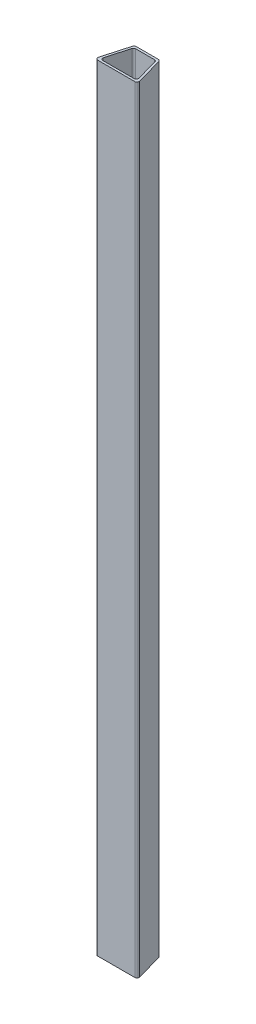
ISO-10303-21;
HEADER;
FILE_DESCRIPTION(('STEP AP214'),'2;1');
FILE_NAME('part.step','',(''),(''),'','','');
FILE_SCHEMA(('AUTOMOTIVE_DESIGN { 1 0 10303 214 1 1 1 1 }'));
ENDSEC;
DATA;
#1=APPLICATION_CONTEXT('core data for automotive mechanical design processes');
#2=APPLICATION_PROTOCOL_DEFINITION('international standard','automotive_design',2000,#1);
#3=PRODUCT_CONTEXT('',#1,'mechanical');
#4=PRODUCT('Part','Part','',(#3));
#5=PRODUCT_RELATED_PRODUCT_CATEGORY('part','',(#4));
#6=PRODUCT_DEFINITION_FORMATION('','',#4);
#7=PRODUCT_DEFINITION_CONTEXT('part definition',#1,'design');
#8=PRODUCT_DEFINITION('design','',#6,#7);
#9=PRODUCT_DEFINITION_SHAPE('','',#8);
#10=(LENGTH_UNIT() NAMED_UNIT(*) SI_UNIT(.MILLI.,.METRE.));
#11=(NAMED_UNIT(*) PLANE_ANGLE_UNIT() SI_UNIT($,.RADIAN.));
#12=(NAMED_UNIT(*) SI_UNIT($,.STERADIAN.) SOLID_ANGLE_UNIT());
#13=UNCERTAINTY_MEASURE_WITH_UNIT(LENGTH_MEASURE(1.E-05),#10,'distance_accuracy_value','');
#14=(GEOMETRIC_REPRESENTATION_CONTEXT(3) GLOBAL_UNCERTAINTY_ASSIGNED_CONTEXT((#13)) GLOBAL_UNIT_ASSIGNED_CONTEXT((#10,
#11,#12)) REPRESENTATION_CONTEXT('',''));
#15=CARTESIAN_POINT('',(0.,0.,0.));
#16=DIRECTION('',(0.,0.,1.));
#17=DIRECTION('',(1.,0.,0.));
#18=AXIS2_PLACEMENT_3D('',#15,#16,#17);
#19=CARTESIAN_POINT('',(-4.98490373267567,350.,-6.));
#20=DIRECTION('',(0.,-1.,0.));
#21=DIRECTION('',(0.,0.,-1.));
#22=AXIS2_PLACEMENT_3D('',#19,#20,#21);
#23=CYLINDRICAL_SURFACE('',#22,0.999999999999999);
#24=CARTESIAN_POINT('',(-4.98490373267567,350.,-6.));
#25=DIRECTION('',(0.,-1.,0.));
#26=DIRECTION('',(0.,0.,-1.));
#27=AXIS2_PLACEMENT_3D('',#24,#25,#26);
#28=CIRCLE('',#27,0.999999999999999);
#29=CARTESIAN_POINT('',(-5.94755467282956,350.,-6.27074557691828));
#30=VERTEX_POINT('',#29);
#31=CARTESIAN_POINT('',(-4.98490373267567,350.,-7.));
#32=VERTEX_POINT('',#31);
#33=EDGE_CURVE('E126',#30,#32,#28,.T.);
#34=ORIENTED_EDGE('',*,*,#33,.T.);
#35=DIRECTION('',(0.,1.,0.));
#36=VECTOR('',#35,1.);
#37=CARTESIAN_POINT('',(-4.98490373267567,350.,-7.));
#38=LINE('',#37,#36);
#39=CARTESIAN_POINT('',(-4.98490373267567,0.,-7.));
#40=VERTEX_POINT('',#39);
#41=EDGE_CURVE('E124',#32,#40,#38,.F.);
#42=ORIENTED_EDGE('',*,*,#41,.T.);
#43=CARTESIAN_POINT('',(-4.98490373267567,0.,-6.));
#44=DIRECTION('',(0.,-1.,0.));
#45=DIRECTION('',(0.,0.,-1.));
#46=AXIS2_PLACEMENT_3D('',#43,#44,#45);
#47=CIRCLE('',#46,0.999999999999999);
#48=CARTESIAN_POINT('',(-5.94755467282956,0.,-6.27074557691828));
#49=VERTEX_POINT('',#48);
#50=EDGE_CURVE('E20',#40,#49,#47,.F.);
#51=ORIENTED_EDGE('',*,*,#50,.T.);
#52=DIRECTION('',(0.,1.,0.));
#53=VECTOR('',#52,1.);
#54=CARTESIAN_POINT('',(-5.94755467282956,350.,-6.27074557691828));
#55=LINE('',#54,#53);
#56=EDGE_CURVE('E121',#49,#30,#55,.T.);
#57=ORIENTED_EDGE('',*,*,#56,.T.);
#58=EDGE_LOOP('',(#34,#42,#51,#57));
#59=FACE_BOUND('',#58,.T.);
#60=ADVANCED_FACE('F17',(#59),#23,.T.);
#61=CARTESIAN_POINT('',(4.98490373267567,350.,-6.));
#62=DIRECTION('',(0.,-1.,0.));
#63=DIRECTION('',(0.,0.,-1.));
#64=AXIS2_PLACEMENT_3D('',#61,#62,#63);
#65=CYLINDRICAL_SURFACE('',#64,0.999999999999998);
#66=CARTESIAN_POINT('',(4.98490373267567,350.,-6.));
#67=DIRECTION('',(0.,-1.,0.));
#68=DIRECTION('',(0.,0.,-1.));
#69=AXIS2_PLACEMENT_3D('',#66,#67,#68);
#70=CIRCLE('',#69,0.999999999999998);
#71=CARTESIAN_POINT('',(4.98490373267567,350.,-7.));
#72=VERTEX_POINT('',#71);
#73=CARTESIAN_POINT('',(5.94755467282956,350.,-6.27074557691829));
#74=VERTEX_POINT('',#73);
#75=EDGE_CURVE('E235',#72,#74,#70,.T.);
#76=ORIENTED_EDGE('',*,*,#75,.T.);
#77=DIRECTION('',(0.,1.,0.));
#78=VECTOR('',#77,1.);
#79=CARTESIAN_POINT('',(5.94755467282956,350.,-6.27074557691828));
#80=LINE('',#79,#78);
#81=CARTESIAN_POINT('',(5.94755467282956,0.,-6.27074557691829));
#82=VERTEX_POINT('',#81);
#83=EDGE_CURVE('E202',#74,#82,#80,.F.);
#84=ORIENTED_EDGE('',*,*,#83,.T.);
#85=CARTESIAN_POINT('',(4.98490373267567,0.,-6.));
#86=DIRECTION('',(0.,-1.,0.));
#87=DIRECTION('',(0.,0.,-1.));
#88=AXIS2_PLACEMENT_3D('',#85,#86,#87);
#89=CIRCLE('',#88,0.999999999999998);
#90=CARTESIAN_POINT('',(4.98490373267567,0.,-7.));
#91=VERTEX_POINT('',#90);
#92=EDGE_CURVE('E237',#82,#91,#89,.F.);
#93=ORIENTED_EDGE('',*,*,#92,.T.);
#94=DIRECTION('',(0.,1.,0.));
#95=VECTOR('',#94,1.);
#96=CARTESIAN_POINT('',(4.98490373267567,350.,-7.));
#97=LINE('',#96,#95);
#98=EDGE_CURVE('E133',#91,#72,#97,.T.);
#99=ORIENTED_EDGE('',*,*,#98,.T.);
#100=EDGE_LOOP('',(#76,#84,#93,#99));
#101=FACE_BOUND('',#100,.T.);
#102=ADVANCED_FACE('F248',(#101),#65,.T.);
#103=CARTESIAN_POINT('',(4.2273555990135,350.,-5.));
#104=DIRECTION('',(0.,-1.,0.));
#105=DIRECTION('',(0.,0.,-1.));
#106=AXIS2_PLACEMENT_3D('',#103,#104,#105);
#107=CYLINDRICAL_SURFACE('',#106,0.999999999999999);
#108=DIRECTION('',(0.,1.,0.));
#109=VECTOR('',#108,1.);
#110=CARTESIAN_POINT('',(5.1900065391674,350.,-5.27074557691828));
#111=LINE('',#110,#109);
#112=CARTESIAN_POINT('',(5.1900065391674,350.,-5.27074557691828));
#113=VERTEX_POINT('',#112);
#114=CARTESIAN_POINT('',(5.1900065391674,0.,-5.27074557691828));
#115=VERTEX_POINT('',#114);
#116=EDGE_CURVE('E184',#113,#115,#111,.F.);
#117=ORIENTED_EDGE('',*,*,#116,.F.);
#118=CARTESIAN_POINT('',(4.2273555990135,350.,-5.));
#119=DIRECTION('',(0.,-1.,0.));
#120=DIRECTION('',(0.,0.,-1.));
#121=AXIS2_PLACEMENT_3D('',#118,#119,#120);
#122=CIRCLE('',#121,0.999999999999999);
#123=CARTESIAN_POINT('',(4.2273555990135,350.,-6.));
#124=VERTEX_POINT('',#123);
#125=EDGE_CURVE('E233',#124,#113,#122,.T.);
#126=ORIENTED_EDGE('',*,*,#125,.F.);
#127=DIRECTION('',(0.,1.,0.));
#128=VECTOR('',#127,1.);
#129=CARTESIAN_POINT('',(4.22735559901349,350.,-6.));
#130=LINE('',#129,#128);
#131=CARTESIAN_POINT('',(4.2273555990135,0.,-6.));
#132=VERTEX_POINT('',#131);
#133=EDGE_CURVE('E180',#132,#124,#130,.T.);
#134=ORIENTED_EDGE('',*,*,#133,.F.);
#135=CARTESIAN_POINT('',(4.2273555990135,0.,-5.));
#136=DIRECTION('',(0.,-1.,0.));
#137=DIRECTION('',(0.,0.,-1.));
#138=AXIS2_PLACEMENT_3D('',#135,#136,#137);
#139=CIRCLE('',#138,0.999999999999999);
#140=EDGE_CURVE('E231',#115,#132,#139,.F.);
#141=ORIENTED_EDGE('',*,*,#140,.F.);
#142=EDGE_LOOP('',(#117,#126,#134,#141));
#143=FACE_BOUND('',#142,.T.);
#144=ADVANCED_FACE('F297',(#143),#107,.F.);
#145=CARTESIAN_POINT('',(-4.2273555990135,350.,-5.));
#146=DIRECTION('',(0.,-1.,0.));
#147=DIRECTION('',(0.,0.,-1.));
#148=AXIS2_PLACEMENT_3D('',#145,#146,#147);
#149=CYLINDRICAL_SURFACE('',#148,1.);
#150=DIRECTION('',(0.,1.,0.));
#151=VECTOR('',#150,1.);
#152=CARTESIAN_POINT('',(-4.22735559901349,350.,-6.));
#153=LINE('',#152,#151);
#154=CARTESIAN_POINT('',(-4.2273555990135,350.,-6.));
#155=VERTEX_POINT('',#154);
#156=CARTESIAN_POINT('',(-4.2273555990135,0.,-6.));
#157=VERTEX_POINT('',#156);
#158=EDGE_CURVE('E183',#155,#157,#153,.F.);
#159=ORIENTED_EDGE('',*,*,#158,.F.);
#160=CARTESIAN_POINT('',(-4.2273555990135,350.,-5.));
#161=DIRECTION('',(0.,-1.,0.));
#162=DIRECTION('',(0.,0.,-1.));
#163=AXIS2_PLACEMENT_3D('',#160,#161,#162);
#164=CIRCLE('',#163,1.);
#165=CARTESIAN_POINT('',(-5.1900065391674,350.,-5.27074557691828));
#166=VERTEX_POINT('',#165);
#167=EDGE_CURVE('E229',#166,#155,#164,.T.);
#168=ORIENTED_EDGE('',*,*,#167,.F.);
#169=DIRECTION('',(0.,1.,0.));
#170=VECTOR('',#169,1.);
#171=CARTESIAN_POINT('',(-5.1900065391674,350.,-5.27074557691828));
#172=LINE('',#171,#170);
#173=CARTESIAN_POINT('',(-5.1900065391674,0.,-5.27074557691828));
#174=VERTEX_POINT('',#173);
#175=EDGE_CURVE('E199',#174,#166,#172,.T.);
#176=ORIENTED_EDGE('',*,*,#175,.F.);
#177=CARTESIAN_POINT('',(-4.2273555990135,0.,-5.));
#178=DIRECTION('',(0.,-1.,0.));
#179=DIRECTION('',(0.,0.,-1.));
#180=AXIS2_PLACEMENT_3D('',#177,#178,#179);
#181=CIRCLE('',#180,1.);
#182=EDGE_CURVE('E134',#157,#174,#181,.F.);
#183=ORIENTED_EDGE('',*,*,#182,.F.);
#184=EDGE_LOOP('',(#159,#168,#176,#183));
#185=FACE_BOUND('',#184,.T.);
#186=ADVANCED_FACE('F270',(#185),#149,.F.);
#187=CARTESIAN_POINT('',(-5.94755467282956,350.,-6.27074557691828));
#188=DIRECTION('',(0.962650940153899,0.,0.270745576918284));
#189=DIRECTION('',(0.270745576918284,0.,-0.962650940153899));
#190=AXIS2_PLACEMENT_3D('',#187,#188,#189);
#191=PLANE('',#190);
#192=DIRECTION('',(0.,-1.,0.));
#193=VECTOR('',#192,1.);
#194=CARTESIAN_POINT('',(-9.32255467282956,350.,5.72925442308172));
#195=LINE('',#194,#193);
#196=CARTESIAN_POINT('',(-9.32255467282957,350.,5.72925442308172));
#197=VERTEX_POINT('',#196);
#198=CARTESIAN_POINT('',(-9.32255467282957,0.,5.72925442308172));
#199=VERTEX_POINT('',#198);
#200=EDGE_CURVE('E179',#197,#199,#195,.T.);
#201=ORIENTED_EDGE('',*,*,#200,.F.);
#202=DIRECTION('',(0.270745576918284,0.,-0.962650940153899));
#203=VECTOR('',#202,1.);
#204=CARTESIAN_POINT('',(-9.32255467282957,350.,5.72925442308172));
#205=LINE('',#204,#203);
#206=EDGE_CURVE('E132',#197,#30,#205,.T.);
#207=ORIENTED_EDGE('',*,*,#206,.T.);
#208=ORIENTED_EDGE('',*,*,#56,.F.);
#209=DIRECTION('',(0.270745576918284,0.,-0.962650940153899));
#210=VECTOR('',#209,1.);
#211=CARTESIAN_POINT('',(-9.32255467282957,0.,5.72925442308172));
#212=LINE('',#211,#210);
#213=EDGE_CURVE('E131',#199,#49,#212,.T.);
#214=ORIENTED_EDGE('',*,*,#213,.F.);
#215=EDGE_LOOP('',(#201,#207,#208,#214));
#216=FACE_BOUND('',#215,.T.);
#217=ADVANCED_FACE('F130',(#216),#191,.F.);
#218=CARTESIAN_POINT('',(-4.98490373267567,350.,-7.));
#219=DIRECTION('',(0.,0.,1.));
#220=DIRECTION('',(1.,0.,0.));
#221=AXIS2_PLACEMENT_3D('',#218,#219,#220);
#222=PLANE('',#221);
#223=ORIENTED_EDGE('',*,*,#41,.F.);
#224=DIRECTION('',(1.,0.,0.));
#225=VECTOR('',#224,1.);
#226=CARTESIAN_POINT('',(-8.35990373267567,350.,-7.));
#227=LINE('',#226,#225);
#228=EDGE_CURVE('E175',#32,#72,#227,.T.);
#229=ORIENTED_EDGE('',*,*,#228,.T.);
#230=ORIENTED_EDGE('',*,*,#98,.F.);
#231=DIRECTION('',(1.,0.,0.));
#232=VECTOR('',#231,1.);
#233=CARTESIAN_POINT('',(-8.35990373267567,0.,-7.));
#234=LINE('',#233,#232);
#235=EDGE_CURVE('E140',#40,#91,#234,.T.);
#236=ORIENTED_EDGE('',*,*,#235,.F.);
#237=EDGE_LOOP('',(#223,#229,#230,#236));
#238=FACE_BOUND('',#237,.T.);
#239=ADVANCED_FACE('F241',(#238),#222,.F.);
#240=CARTESIAN_POINT('',(5.94755467282956,350.,-6.27074557691828));
#241=DIRECTION('',(-0.962650940153899,0.,0.270745576918284));
#242=DIRECTION('',(0.270745576918284,0.,0.962650940153899));
#243=AXIS2_PLACEMENT_3D('',#240,#241,#242);
#244=PLANE('',#243);
#245=ORIENTED_EDGE('',*,*,#83,.F.);
#246=DIRECTION('',(0.270745576918284,0.,0.962650940153899));
#247=VECTOR('',#246,1.);
#248=CARTESIAN_POINT('',(5.94755467282956,350.,-6.27074557691828));
#249=LINE('',#248,#247);
#250=CARTESIAN_POINT('',(9.32255467282957,350.,5.72925442308172));
#251=VERTEX_POINT('',#250);
#252=EDGE_CURVE('E172',#74,#251,#249,.T.);
#253=ORIENTED_EDGE('',*,*,#252,.T.);
#254=DIRECTION('',(0.,-1.,0.));
#255=VECTOR('',#254,1.);
#256=CARTESIAN_POINT('',(9.32255467282956,350.,5.72925442308172));
#257=LINE('',#256,#255);
#258=CARTESIAN_POINT('',(9.32255467282957,0.,5.72925442308172));
#259=VERTEX_POINT('',#258);
#260=EDGE_CURVE('E203',#259,#251,#257,.F.);
#261=ORIENTED_EDGE('',*,*,#260,.F.);
#262=DIRECTION('',(0.270745576918284,0.,0.962650940153899));
#263=VECTOR('',#262,1.);
#264=CARTESIAN_POINT('',(5.94755467282956,0.,-6.27074557691828));
#265=LINE('',#264,#263);
#266=EDGE_CURVE('E142',#82,#259,#265,.T.);
#267=ORIENTED_EDGE('',*,*,#266,.F.);
#268=EDGE_LOOP('',(#245,#253,#261,#267));
#269=FACE_BOUND('',#268,.T.);
#270=ADVANCED_FACE('F252',(#269),#244,.F.);
#271=CARTESIAN_POINT('',(-5.1900065391674,350.,-5.27074557691828));
#272=DIRECTION('',(0.962650940153899,0.,0.270745576918284));
#273=DIRECTION('',(0.270745576918284,0.,-0.962650940153899));
#274=AXIS2_PLACEMENT_3D('',#271,#272,#273);
#275=PLANE('',#274);
#276=DIRECTION('',(-0.270745576918284,0.,0.962650940153899));
#277=VECTOR('',#276,1.);
#278=CARTESIAN_POINT('',(-5.1900065391674,350.,-5.27074557691828));
#279=LINE('',#278,#277);
#280=CARTESIAN_POINT('',(-8.0025065391674,350.,4.72925442308171));
#281=VERTEX_POINT('',#280);
#282=EDGE_CURVE('E157',#166,#281,#279,.T.);
#283=ORIENTED_EDGE('',*,*,#282,.T.);
#284=DIRECTION('',(0.,-1.,0.));
#285=VECTOR('',#284,1.);
#286=CARTESIAN_POINT('',(-8.0025065391674,350.,4.72925442308171));
#287=LINE('',#286,#285);
#288=CARTESIAN_POINT('',(-8.0025065391674,0.,4.72925442308171));
#289=VERTEX_POINT('',#288);
#290=EDGE_CURVE('E196',#281,#289,#287,.T.);
#291=ORIENTED_EDGE('',*,*,#290,.T.);
#292=DIRECTION('',(-0.270745576918284,0.,0.962650940153899));
#293=VECTOR('',#292,1.);
#294=CARTESIAN_POINT('',(-5.1900065391674,0.,-5.27074557691828));
#295=LINE('',#294,#293);
#296=EDGE_CURVE('E219',#174,#289,#295,.T.);
#297=ORIENTED_EDGE('',*,*,#296,.F.);
#298=ORIENTED_EDGE('',*,*,#175,.T.);
#299=EDGE_LOOP('',(#283,#291,#297,#298));
#300=FACE_BOUND('',#299,.T.);
#301=ADVANCED_FACE('F274',(#300),#275,.T.);
#302=CARTESIAN_POINT('',(-7.0398555990135,350.,5.));
#303=DIRECTION('',(0.,-1.,0.));
#304=DIRECTION('',(0.,0.,-1.));
#305=AXIS2_PLACEMENT_3D('',#302,#303,#304);
#306=CYLINDRICAL_SURFACE('',#305,1.);
#307=ORIENTED_EDGE('',*,*,#290,.F.);
#308=CARTESIAN_POINT('',(-7.0398555990135,350.,5.));
#309=DIRECTION('',(0.,-1.,0.));
#310=DIRECTION('',(0.,0.,-1.));
#311=AXIS2_PLACEMENT_3D('',#308,#309,#310);
#312=CIRCLE('',#311,1.);
#313=CARTESIAN_POINT('',(-7.0398555990135,350.,6.));
#314=VERTEX_POINT('',#313);
#315=EDGE_CURVE('E160',#281,#314,#312,.F.);
#316=ORIENTED_EDGE('',*,*,#315,.T.);
#317=DIRECTION('',(0.,1.,0.));
#318=VECTOR('',#317,1.);
#319=CARTESIAN_POINT('',(-7.03985559901349,350.,6.));
#320=LINE('',#319,#318);
#321=CARTESIAN_POINT('',(-7.0398555990135,0.,6.));
#322=VERTEX_POINT('',#321);
#323=EDGE_CURVE('E194',#322,#314,#320,.T.);
#324=ORIENTED_EDGE('',*,*,#323,.F.);
#325=CARTESIAN_POINT('',(-7.0398555990135,0.,5.));
#326=DIRECTION('',(0.,-1.,0.));
#327=DIRECTION('',(0.,0.,-1.));
#328=AXIS2_PLACEMENT_3D('',#325,#326,#327);
#329=CIRCLE('',#328,1.);
#330=EDGE_CURVE('E216',#289,#322,#329,.F.);
#331=ORIENTED_EDGE('',*,*,#330,.F.);
#332=EDGE_LOOP('',(#307,#316,#324,#331));
#333=FACE_BOUND('',#332,.T.);
#334=ADVANCED_FACE('F301',(#333),#306,.F.);
#335=CARTESIAN_POINT('',(-7.03985559901349,350.,6.));
#336=DIRECTION('',(0.,0.,-1.));
#337=DIRECTION('',(-1.,0.,0.));
#338=AXIS2_PLACEMENT_3D('',#335,#336,#337);
#339=PLANE('',#338);
#340=DIRECTION('',(1.,0.,0.));
#341=VECTOR('',#340,1.);
#342=CARTESIAN_POINT('',(-8.35990373267567,350.,6.));
#343=LINE('',#342,#341);
#344=CARTESIAN_POINT('',(7.0398555990135,350.,6.));
#345=VERTEX_POINT('',#344);
#346=EDGE_CURVE('E168',#314,#345,#343,.T.);
#347=ORIENTED_EDGE('',*,*,#346,.T.);
#348=DIRECTION('',(0.,-1.,0.));
#349=VECTOR('',#348,1.);
#350=CARTESIAN_POINT('',(7.03985559901349,350.,6.));
#351=LINE('',#350,#349);
#352=CARTESIAN_POINT('',(7.0398555990135,0.,6.));
#353=VERTEX_POINT('',#352);
#354=EDGE_CURVE('E189',#345,#353,#351,.T.);
#355=ORIENTED_EDGE('',*,*,#354,.T.);
#356=DIRECTION('',(1.,0.,0.));
#357=VECTOR('',#356,1.);
#358=CARTESIAN_POINT('',(-8.35990373267567,0.,6.));
#359=LINE('',#358,#357);
#360=EDGE_CURVE('E215',#322,#353,#359,.T.);
#361=ORIENTED_EDGE('',*,*,#360,.F.);
#362=ORIENTED_EDGE('',*,*,#323,.T.);
#363=EDGE_LOOP('',(#347,#355,#361,#362));
#364=FACE_BOUND('',#363,.T.);
#365=ADVANCED_FACE('F286',(#364),#339,.T.);
#366=CARTESIAN_POINT('',(7.0398555990135,350.,5.));
#367=DIRECTION('',(0.,-1.,0.));
#368=DIRECTION('',(0.,0.,-1.));
#369=AXIS2_PLACEMENT_3D('',#366,#367,#368);
#370=CYLINDRICAL_SURFACE('',#369,1.);
#371=ORIENTED_EDGE('',*,*,#354,.F.);
#372=CARTESIAN_POINT('',(7.0398555990135,350.,5.));
#373=DIRECTION('',(0.,-1.,0.));
#374=DIRECTION('',(0.,0.,-1.));
#375=AXIS2_PLACEMENT_3D('',#372,#373,#374);
#376=CIRCLE('',#375,1.);
#377=CARTESIAN_POINT('',(8.0025065391674,350.,4.72925442308172));
#378=VERTEX_POINT('',#377);
#379=EDGE_CURVE('E167',#345,#378,#376,.F.);
#380=ORIENTED_EDGE('',*,*,#379,.T.);
#381=DIRECTION('',(0.,1.,0.));
#382=VECTOR('',#381,1.);
#383=CARTESIAN_POINT('',(8.0025065391674,350.,4.72925442308171));
#384=LINE('',#383,#382);
#385=CARTESIAN_POINT('',(8.0025065391674,0.,4.72925442308172));
#386=VERTEX_POINT('',#385);
#387=EDGE_CURVE('E187',#386,#378,#384,.T.);
#388=ORIENTED_EDGE('',*,*,#387,.F.);
#389=CARTESIAN_POINT('',(7.0398555990135,0.,5.));
#390=DIRECTION('',(0.,-1.,0.));
#391=DIRECTION('',(0.,0.,-1.));
#392=AXIS2_PLACEMENT_3D('',#389,#390,#391);
#393=CIRCLE('',#392,1.);
#394=EDGE_CURVE('E211',#353,#386,#393,.F.);
#395=ORIENTED_EDGE('',*,*,#394,.F.);
#396=EDGE_LOOP('',(#371,#380,#388,#395));
#397=FACE_BOUND('',#396,.T.);
#398=ADVANCED_FACE('F290',(#397),#370,.F.);
#399=CARTESIAN_POINT('',(5.1900065391674,350.,-5.27074557691828));
#400=DIRECTION('',(-0.962650940153899,0.,0.270745576918284));
#401=DIRECTION('',(0.270745576918284,0.,0.962650940153899));
#402=AXIS2_PLACEMENT_3D('',#399,#400,#401);
#403=PLANE('',#402);
#404=DIRECTION('',(-0.270745576918284,0.,-0.962650940153899));
#405=VECTOR('',#404,1.);
#406=CARTESIAN_POINT('',(8.0025065391674,350.,4.72925442308171));
#407=LINE('',#406,#405);
#408=EDGE_CURVE('E164',#378,#113,#407,.T.);
#409=ORIENTED_EDGE('',*,*,#408,.T.);
#410=ORIENTED_EDGE('',*,*,#116,.T.);
#411=DIRECTION('',(-0.270745576918284,0.,-0.962650940153899));
#412=VECTOR('',#411,1.);
#413=CARTESIAN_POINT('',(8.0025065391674,0.,4.72925442308171));
#414=LINE('',#413,#412);
#415=EDGE_CURVE('E214',#386,#115,#414,.T.);
#416=ORIENTED_EDGE('',*,*,#415,.F.);
#417=ORIENTED_EDGE('',*,*,#387,.T.);
#418=EDGE_LOOP('',(#409,#410,#416,#417));
#419=FACE_BOUND('',#418,.T.);
#420=ADVANCED_FACE('F294',(#419),#403,.T.);
#421=CARTESIAN_POINT('',(-4.22735559901349,350.,-6.));
#422=DIRECTION('',(0.,0.,1.));
#423=DIRECTION('',(1.,0.,0.));
#424=AXIS2_PLACEMENT_3D('',#421,#422,#423);
#425=PLANE('',#424);
#426=DIRECTION('',(1.,0.,0.));
#427=VECTOR('',#426,1.);
#428=CARTESIAN_POINT('',(-8.35990373267567,350.,-6.));
#429=LINE('',#428,#427);
#430=EDGE_CURVE('E161',#124,#155,#429,.F.);
#431=ORIENTED_EDGE('',*,*,#430,.T.);
#432=ORIENTED_EDGE('',*,*,#158,.T.);
#433=DIRECTION('',(1.,0.,0.));
#434=VECTOR('',#433,1.);
#435=CARTESIAN_POINT('',(-8.35990373267567,0.,-6.));
#436=LINE('',#435,#434);
#437=EDGE_CURVE('E154',#132,#157,#436,.F.);
#438=ORIENTED_EDGE('',*,*,#437,.F.);
#439=ORIENTED_EDGE('',*,*,#133,.T.);
#440=EDGE_LOOP('',(#431,#432,#438,#439));
#441=FACE_BOUND('',#440,.T.);
#442=ADVANCED_FACE('F266',(#441),#425,.T.);
#443=CARTESIAN_POINT('',(-8.35990373267567,350.,6.));
#444=DIRECTION('',(0.,-1.,0.));
#445=DIRECTION('',(0.,0.,-1.));
#446=AXIS2_PLACEMENT_3D('',#443,#444,#445);
#447=CYLINDRICAL_SURFACE('',#446,1.);
#448=CARTESIAN_POINT('',(-8.35990373267567,350.,6.));
#449=DIRECTION('',(0.,-1.,0.));
#450=DIRECTION('',(0.,0.,-1.));
#451=AXIS2_PLACEMENT_3D('',#448,#449,#450);
#452=CIRCLE('',#451,1.);
#453=CARTESIAN_POINT('',(-8.35990373267567,350.,7.));
#454=VERTEX_POINT('',#453);
#455=EDGE_CURVE('E171',#454,#197,#452,.T.);
#456=ORIENTED_EDGE('',*,*,#455,.T.);
#457=ORIENTED_EDGE('',*,*,#200,.T.);
#458=CARTESIAN_POINT('',(-8.35990373267567,0.,6.));
#459=DIRECTION('',(0.,-1.,0.));
#460=DIRECTION('',(0.,0.,-1.));
#461=AXIS2_PLACEMENT_3D('',#458,#459,#460);
#462=CIRCLE('',#461,1.);
#463=CARTESIAN_POINT('',(-8.35990373267567,0.,7.));
#464=VERTEX_POINT('',#463);
#465=EDGE_CURVE('E139',#464,#199,#462,.T.);
#466=ORIENTED_EDGE('',*,*,#465,.F.);
#467=DIRECTION('',(0.,1.,0.));
#468=VECTOR('',#467,1.);
#469=CARTESIAN_POINT('',(-8.35990373267567,350.,7.));
#470=LINE('',#469,#468);
#471=EDGE_CURVE('E151',#464,#454,#470,.T.);
#472=ORIENTED_EDGE('',*,*,#471,.T.);
#473=EDGE_LOOP('',(#456,#457,#466,#472));
#474=FACE_BOUND('',#473,.T.);
#475=ADVANCED_FACE('F327',(#474),#447,.T.);
#476=CARTESIAN_POINT('',(-8.35990373267567,350.,6.));
#477=DIRECTION('',(0.,-1.,0.));
#478=DIRECTION('',(0.,0.,-1.));
#479=AXIS2_PLACEMENT_3D('',#476,#477,#478);
#480=PLANE('',#479);
#481=ORIENTED_EDGE('',*,*,#282,.F.);
#482=ORIENTED_EDGE('',*,*,#167,.T.);
#483=ORIENTED_EDGE('',*,*,#430,.F.);
#484=ORIENTED_EDGE('',*,*,#125,.T.);
#485=ORIENTED_EDGE('',*,*,#408,.F.);
#486=ORIENTED_EDGE('',*,*,#379,.F.);
#487=ORIENTED_EDGE('',*,*,#346,.F.);
#488=ORIENTED_EDGE('',*,*,#315,.F.);
#489=EDGE_LOOP('',(#481,#482,#483,#484,#485,#486,#487,#488));
#490=FACE_BOUND('',#489,.T.);
#491=DIRECTION('',(-1.,0.,0.));
#492=VECTOR('',#491,1.);
#493=CARTESIAN_POINT('',(-8.35990373267567,350.,7.));
#494=LINE('',#493,#492);
#495=CARTESIAN_POINT('',(8.35990373267567,350.,7.));
#496=VERTEX_POINT('',#495);
#497=EDGE_CURVE('E149',#454,#496,#494,.F.);
#498=ORIENTED_EDGE('',*,*,#497,.T.);
#499=CARTESIAN_POINT('',(8.35990373267567,350.,6.));
#500=DIRECTION('',(0.,-1.,0.));
#501=DIRECTION('',(0.,0.,-1.));
#502=AXIS2_PLACEMENT_3D('',#499,#500,#501);
#503=CIRCLE('',#502,1.);
#504=EDGE_CURVE('E144',#251,#496,#503,.T.);
#505=ORIENTED_EDGE('',*,*,#504,.F.);
#506=ORIENTED_EDGE('',*,*,#252,.F.);
#507=ORIENTED_EDGE('',*,*,#75,.F.);
#508=ORIENTED_EDGE('',*,*,#228,.F.);
#509=ORIENTED_EDGE('',*,*,#33,.F.);
#510=ORIENTED_EDGE('',*,*,#206,.F.);
#511=ORIENTED_EDGE('',*,*,#455,.F.);
#512=EDGE_LOOP('',(#498,#505,#506,#507,#508,#509,#510,#511));
#513=FACE_BOUND('',#512,.T.);
#514=ADVANCED_FACE('F243',(#490,#513),#480,.F.);
#515=CARTESIAN_POINT('',(8.35990373267567,350.,6.));
#516=DIRECTION('',(0.,-1.,0.));
#517=DIRECTION('',(0.,0.,-1.));
#518=AXIS2_PLACEMENT_3D('',#515,#516,#517);
#519=CYLINDRICAL_SURFACE('',#518,1.);
#520=ORIENTED_EDGE('',*,*,#504,.T.);
#521=DIRECTION('',(0.,1.,0.));
#522=VECTOR('',#521,1.);
#523=CARTESIAN_POINT('',(8.35990373267567,350.,7.));
#524=LINE('',#523,#522);
#525=CARTESIAN_POINT('',(8.35990373267567,0.,7.));
#526=VERTEX_POINT('',#525);
#527=EDGE_CURVE('E26',#496,#526,#524,.F.);
#528=ORIENTED_EDGE('',*,*,#527,.T.);
#529=CARTESIAN_POINT('',(8.35990373267567,0.,6.));
#530=DIRECTION('',(0.,-1.,0.));
#531=DIRECTION('',(0.,0.,-1.));
#532=AXIS2_PLACEMENT_3D('',#529,#530,#531);
#533=CIRCLE('',#532,1.);
#534=EDGE_CURVE('E34',#259,#526,#533,.T.);
#535=ORIENTED_EDGE('',*,*,#534,.F.);
#536=ORIENTED_EDGE('',*,*,#260,.T.);
#537=EDGE_LOOP('',(#520,#528,#535,#536));
#538=FACE_BOUND('',#537,.T.);
#539=ADVANCED_FACE('F318',(#538),#519,.T.);
#540=CARTESIAN_POINT('',(-8.35990373267567,0.,6.));
#541=DIRECTION('',(0.,-1.,0.));
#542=DIRECTION('',(0.,0.,-1.));
#543=AXIS2_PLACEMENT_3D('',#540,#541,#542);
#544=PLANE('',#543);
#545=ORIENTED_EDGE('',*,*,#437,.T.);
#546=ORIENTED_EDGE('',*,*,#182,.T.);
#547=ORIENTED_EDGE('',*,*,#296,.T.);
#548=ORIENTED_EDGE('',*,*,#330,.T.);
#549=ORIENTED_EDGE('',*,*,#360,.T.);
#550=ORIENTED_EDGE('',*,*,#394,.T.);
#551=ORIENTED_EDGE('',*,*,#415,.T.);
#552=ORIENTED_EDGE('',*,*,#140,.T.);
#553=EDGE_LOOP('',(#545,#546,#547,#548,#549,#550,#551,#552));
#554=FACE_BOUND('',#553,.T.);
#555=ORIENTED_EDGE('',*,*,#534,.T.);
#556=DIRECTION('',(-1.,0.,0.));
#557=VECTOR('',#556,1.);
#558=CARTESIAN_POINT('',(-8.35990373267567,0.,7.));
#559=LINE('',#558,#557);
#560=EDGE_CURVE('E11',#526,#464,#559,.T.);
#561=ORIENTED_EDGE('',*,*,#560,.T.);
#562=ORIENTED_EDGE('',*,*,#465,.T.);
#563=ORIENTED_EDGE('',*,*,#213,.T.);
#564=ORIENTED_EDGE('',*,*,#50,.F.);
#565=ORIENTED_EDGE('',*,*,#235,.T.);
#566=ORIENTED_EDGE('',*,*,#92,.F.);
#567=ORIENTED_EDGE('',*,*,#266,.T.);
#568=EDGE_LOOP('',(#555,#561,#562,#563,#564,#565,#566,#567));
#569=FACE_BOUND('',#568,.T.);
#570=ADVANCED_FACE('F137',(#554,#569),#544,.T.);
#571=CARTESIAN_POINT('',(-8.35990373267567,350.,7.));
#572=DIRECTION('',(0.,0.,-1.));
#573=DIRECTION('',(-1.,0.,0.));
#574=AXIS2_PLACEMENT_3D('',#571,#572,#573);
#575=PLANE('',#574);
#576=ORIENTED_EDGE('',*,*,#527,.F.);
#577=ORIENTED_EDGE('',*,*,#497,.F.);
#578=ORIENTED_EDGE('',*,*,#471,.F.);
#579=ORIENTED_EDGE('',*,*,#560,.F.);
#580=EDGE_LOOP('',(#576,#577,#578,#579));
#581=FACE_BOUND('',#580,.T.);
#582=ADVANCED_FACE('F311',(#581),#575,.F.);
#583=CLOSED_SHELL('',(#60,#102,#144,#186,#217,#239,#270,#301,#334,#365,#398,#420,#442,#475,#514,
#539,#570,#582));
#584=MANIFOLD_SOLID_BREP('B1',#583);
#585=ADVANCED_BREP_SHAPE_REPRESENTATION('',(#18,#584),#14);
#586=SHAPE_DEFINITION_REPRESENTATION(#9,#585);
ENDSEC;
END-ISO-10303-21;
